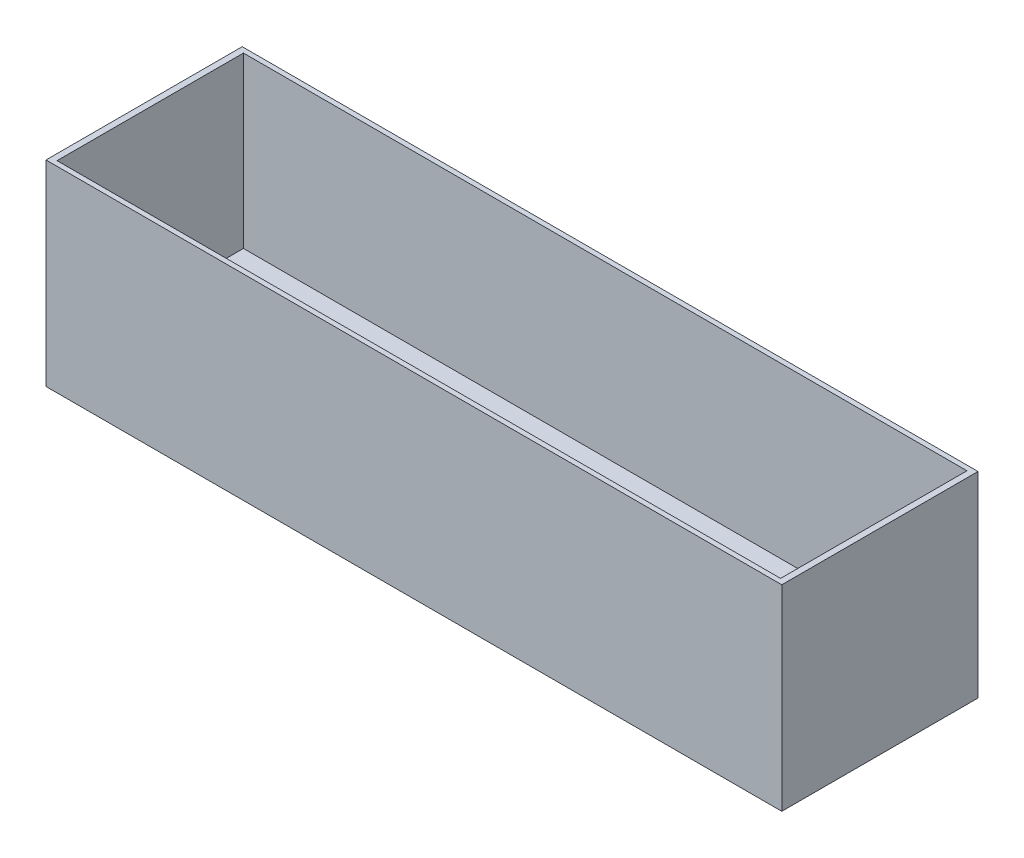
ISO-10303-21;
HEADER;
FILE_DESCRIPTION(('STEP AP214'),'2;1');
FILE_NAME('part.step','',(''),(''),'','','');
FILE_SCHEMA(('AUTOMOTIVE_DESIGN { 1 0 10303 214 1 1 1 1 }'));
ENDSEC;
DATA;
#1=APPLICATION_CONTEXT('core data for automotive mechanical design processes');
#2=APPLICATION_PROTOCOL_DEFINITION('international standard','automotive_design',2000,#1);
#3=PRODUCT_CONTEXT('',#1,'mechanical');
#4=PRODUCT('Part','Part','',(#3));
#5=PRODUCT_RELATED_PRODUCT_CATEGORY('part','',(#4));
#6=PRODUCT_DEFINITION_FORMATION('','',#4);
#7=PRODUCT_DEFINITION_CONTEXT('part definition',#1,'design');
#8=PRODUCT_DEFINITION('design','',#6,#7);
#9=PRODUCT_DEFINITION_SHAPE('','',#8);
#10=(LENGTH_UNIT() NAMED_UNIT(*) SI_UNIT(.MILLI.,.METRE.));
#11=(NAMED_UNIT(*) PLANE_ANGLE_UNIT() SI_UNIT($,.RADIAN.));
#12=(NAMED_UNIT(*) SI_UNIT($,.STERADIAN.) SOLID_ANGLE_UNIT());
#13=UNCERTAINTY_MEASURE_WITH_UNIT(LENGTH_MEASURE(1.E-05),#10,'distance_accuracy_value','');
#14=(GEOMETRIC_REPRESENTATION_CONTEXT(3) GLOBAL_UNCERTAINTY_ASSIGNED_CONTEXT((#13)) GLOBAL_UNIT_ASSIGNED_CONTEXT((#10,
#11,#12)) REPRESENTATION_CONTEXT('',''));
#15=CARTESIAN_POINT('',(0.,0.,0.));
#16=DIRECTION('',(0.,0.,1.));
#17=DIRECTION('',(1.,0.,0.));
#18=AXIS2_PLACEMENT_3D('',#15,#16,#17);
#19=CARTESIAN_POINT('',(-1500.,800.,400.));
#20=DIRECTION('',(0.,0.,-1.));
#21=DIRECTION('',(-1.,0.,0.));
#22=AXIS2_PLACEMENT_3D('',#19,#20,#21);
#23=PLANE('',#22);
#24=DIRECTION('',(1.,0.,0.));
#25=VECTOR('',#24,1.);
#26=CARTESIAN_POINT('',(-1500.,0.,400.));
#27=LINE('',#26,#25);
#28=CARTESIAN_POINT('',(-1500.,0.,400.));
#29=VERTEX_POINT('',#28);
#30=CARTESIAN_POINT('',(1500.,0.,400.));
#31=VERTEX_POINT('',#30);
#32=EDGE_CURVE('E140',#29,#31,#27,.T.);
#33=ORIENTED_EDGE('',*,*,#32,.T.);
#34=DIRECTION('',(0.,-1.,0.));
#35=VECTOR('',#34,1.);
#36=CARTESIAN_POINT('',(1500.,800.,400.));
#37=LINE('',#36,#35);
#38=CARTESIAN_POINT('',(1500.,800.,400.));
#39=VERTEX_POINT('',#38);
#40=EDGE_CURVE('E11',#39,#31,#37,.T.);
#41=ORIENTED_EDGE('',*,*,#40,.F.);
#42=DIRECTION('',(1.,0.,0.));
#43=VECTOR('',#42,1.);
#44=CARTESIAN_POINT('',(-1500.,800.,400.));
#45=LINE('',#44,#43);
#46=CARTESIAN_POINT('',(-1500.,800.,400.));
#47=VERTEX_POINT('',#46);
#48=EDGE_CURVE('E144',#47,#39,#45,.T.);
#49=ORIENTED_EDGE('',*,*,#48,.F.);
#50=DIRECTION('',(0.,-1.,0.));
#51=VECTOR('',#50,1.);
#52=CARTESIAN_POINT('',(-1500.,800.,400.));
#53=LINE('',#52,#51);
#54=EDGE_CURVE('E56',#47,#29,#53,.T.);
#55=ORIENTED_EDGE('',*,*,#54,.T.);
#56=EDGE_LOOP('',(#33,#41,#49,#55));
#57=FACE_BOUND('',#56,.T.);
#58=ADVANCED_FACE('F33',(#57),#23,.F.);
#59=CARTESIAN_POINT('',(1500.,800.,400.));
#60=DIRECTION('',(-1.,0.,0.));
#61=DIRECTION('',(0.,0.,1.));
#62=AXIS2_PLACEMENT_3D('',#59,#60,#61);
#63=PLANE('',#62);
#64=DIRECTION('',(0.,0.,-1.));
#65=VECTOR('',#64,1.);
#66=CARTESIAN_POINT('',(1500.,0.,400.));
#67=LINE('',#66,#65);
#68=CARTESIAN_POINT('',(1500.,0.,-400.));
#69=VERTEX_POINT('',#68);
#70=EDGE_CURVE('E154',#31,#69,#67,.T.);
#71=ORIENTED_EDGE('',*,*,#70,.T.);
#72=DIRECTION('',(0.,-1.,0.));
#73=VECTOR('',#72,1.);
#74=CARTESIAN_POINT('',(1500.,800.,-400.));
#75=LINE('',#74,#73);
#76=CARTESIAN_POINT('',(1500.,800.,-400.));
#77=VERTEX_POINT('',#76);
#78=EDGE_CURVE('E40',#77,#69,#75,.T.);
#79=ORIENTED_EDGE('',*,*,#78,.F.);
#80=DIRECTION('',(0.,0.,-1.));
#81=VECTOR('',#80,1.);
#82=CARTESIAN_POINT('',(1500.,800.,400.));
#83=LINE('',#82,#81);
#84=EDGE_CURVE('E82',#39,#77,#83,.T.);
#85=ORIENTED_EDGE('',*,*,#84,.F.);
#86=ORIENTED_EDGE('',*,*,#40,.T.);
#87=EDGE_LOOP('',(#71,#79,#85,#86));
#88=FACE_BOUND('',#87,.T.);
#89=ADVANCED_FACE('F168',(#88),#63,.F.);
#90=CARTESIAN_POINT('',(-1500.,800.,-400.));
#91=DIRECTION('',(0.,0.,-1.));
#92=DIRECTION('',(-1.,0.,0.));
#93=AXIS2_PLACEMENT_3D('',#90,#91,#92);
#94=PLANE('',#93);
#95=DIRECTION('',(1.,0.,0.));
#96=VECTOR('',#95,1.);
#97=CARTESIAN_POINT('',(-1500.,0.,-400.));
#98=LINE('',#97,#96);
#99=CARTESIAN_POINT('',(-1500.,0.,-400.));
#100=VERTEX_POINT('',#99);
#101=EDGE_CURVE('E157',#100,#69,#98,.T.);
#102=ORIENTED_EDGE('',*,*,#101,.F.);
#103=DIRECTION('',(0.,-1.,0.));
#104=VECTOR('',#103,1.);
#105=CARTESIAN_POINT('',(-1500.,800.,-400.));
#106=LINE('',#105,#104);
#107=CARTESIAN_POINT('',(-1500.,800.,-400.));
#108=VERTEX_POINT('',#107);
#109=EDGE_CURVE('E163',#108,#100,#106,.T.);
#110=ORIENTED_EDGE('',*,*,#109,.F.);
#111=DIRECTION('',(1.,0.,0.));
#112=VECTOR('',#111,1.);
#113=CARTESIAN_POINT('',(-1500.,800.,-400.));
#114=LINE('',#113,#112);
#115=EDGE_CURVE('E148',#108,#77,#114,.T.);
#116=ORIENTED_EDGE('',*,*,#115,.T.);
#117=ORIENTED_EDGE('',*,*,#78,.T.);
#118=EDGE_LOOP('',(#102,#110,#116,#117));
#119=FACE_BOUND('',#118,.T.);
#120=ADVANCED_FACE('F166',(#119),#94,.T.);
#121=CARTESIAN_POINT('',(-1500.,800.,400.));
#122=DIRECTION('',(-1.,0.,0.));
#123=DIRECTION('',(0.,0.,1.));
#124=AXIS2_PLACEMENT_3D('',#121,#122,#123);
#125=PLANE('',#124);
#126=DIRECTION('',(0.,0.,-1.));
#127=VECTOR('',#126,1.);
#128=CARTESIAN_POINT('',(-1500.,0.,400.));
#129=LINE('',#128,#127);
#130=EDGE_CURVE('E146',#29,#100,#129,.T.);
#131=ORIENTED_EDGE('',*,*,#130,.F.);
#132=ORIENTED_EDGE('',*,*,#54,.F.);
#133=DIRECTION('',(0.,0.,-1.));
#134=VECTOR('',#133,1.);
#135=CARTESIAN_POINT('',(-1500.,800.,400.));
#136=LINE('',#135,#134);
#137=EDGE_CURVE('E151',#47,#108,#136,.T.);
#138=ORIENTED_EDGE('',*,*,#137,.T.);
#139=ORIENTED_EDGE('',*,*,#109,.T.);
#140=EDGE_LOOP('',(#131,#132,#138,#139));
#141=FACE_BOUND('',#140,.T.);
#142=ADVANCED_FACE('F172',(#141),#125,.T.);
#143=CARTESIAN_POINT('',(0.,800.,0.));
#144=DIRECTION('',(0.,1.,0.));
#145=DIRECTION('',(0.,0.,1.));
#146=AXIS2_PLACEMENT_3D('',#143,#144,#145);
#147=PLANE('',#146);
#148=DIRECTION('',(0.,0.,1.));
#149=VECTOR('',#148,1.);
#150=CARTESIAN_POINT('',(-1475.,800.,-380.));
#151=LINE('',#150,#149);
#152=CARTESIAN_POINT('',(-1475.,800.,-380.));
#153=VERTEX_POINT('',#152);
#154=CARTESIAN_POINT('',(-1475.,800.,380.));
#155=VERTEX_POINT('',#154);
#156=EDGE_CURVE('E47',#153,#155,#151,.T.);
#157=ORIENTED_EDGE('',*,*,#156,.F.);
#158=DIRECTION('',(-1.,0.,0.));
#159=VECTOR('',#158,1.);
#160=CARTESIAN_POINT('',(1475.,800.,-380.));
#161=LINE('',#160,#159);
#162=CARTESIAN_POINT('',(1475.,800.,-380.));
#163=VERTEX_POINT('',#162);
#164=EDGE_CURVE('E125',#163,#153,#161,.T.);
#165=ORIENTED_EDGE('',*,*,#164,.F.);
#166=DIRECTION('',(0.,0.,-1.));
#167=VECTOR('',#166,1.);
#168=CARTESIAN_POINT('',(1475.,800.,-380.));
#169=LINE('',#168,#167);
#170=CARTESIAN_POINT('',(1475.,800.,380.));
#171=VERTEX_POINT('',#170);
#172=EDGE_CURVE('E128',#171,#163,#169,.T.);
#173=ORIENTED_EDGE('',*,*,#172,.F.);
#174=DIRECTION('',(1.,0.,0.));
#175=VECTOR('',#174,1.);
#176=CARTESIAN_POINT('',(1475.,800.,380.));
#177=LINE('',#176,#175);
#178=EDGE_CURVE('E134',#155,#171,#177,.T.);
#179=ORIENTED_EDGE('',*,*,#178,.F.);
#180=EDGE_LOOP('',(#157,#165,#173,#179));
#181=FACE_BOUND('',#180,.T.);
#182=ORIENTED_EDGE('',*,*,#48,.T.);
#183=ORIENTED_EDGE('',*,*,#84,.T.);
#184=ORIENTED_EDGE('',*,*,#115,.F.);
#185=ORIENTED_EDGE('',*,*,#137,.F.);
#186=EDGE_LOOP('',(#182,#183,#184,#185));
#187=FACE_BOUND('',#186,.T.);
#188=ADVANCED_FACE('F175',(#181,#187),#147,.T.);
#189=CARTESIAN_POINT('',(0.,0.,0.));
#190=DIRECTION('',(0.,1.,0.));
#191=DIRECTION('',(0.,0.,1.));
#192=AXIS2_PLACEMENT_3D('',#189,#190,#191);
#193=PLANE('',#192);
#194=ORIENTED_EDGE('',*,*,#32,.F.);
#195=ORIENTED_EDGE('',*,*,#130,.T.);
#196=ORIENTED_EDGE('',*,*,#101,.T.);
#197=ORIENTED_EDGE('',*,*,#70,.F.);
#198=EDGE_LOOP('',(#194,#195,#196,#197));
#199=FACE_BOUND('',#198,.T.);
#200=ADVANCED_FACE('F171',(#199),#193,.F.);
#201=CARTESIAN_POINT('',(-1475.,110.,-380.));
#202=DIRECTION('',(-1.,0.,0.));
#203=DIRECTION('',(0.,0.,1.));
#204=AXIS2_PLACEMENT_3D('',#201,#202,#203);
#205=PLANE('',#204);
#206=ORIENTED_EDGE('',*,*,#156,.T.);
#207=DIRECTION('',(0.,1.,0.));
#208=VECTOR('',#207,1.);
#209=CARTESIAN_POINT('',(-1475.,110.,380.));
#210=LINE('',#209,#208);
#211=CARTESIAN_POINT('',(-1475.,110.,380.));
#212=VERTEX_POINT('',#211);
#213=EDGE_CURVE('E103',#212,#155,#210,.T.);
#214=ORIENTED_EDGE('',*,*,#213,.F.);
#215=DIRECTION('',(0.,0.,1.));
#216=VECTOR('',#215,1.);
#217=CARTESIAN_POINT('',(-1475.,110.,-380.));
#218=LINE('',#217,#216);
#219=CARTESIAN_POINT('',(-1475.,110.,-380.));
#220=VERTEX_POINT('',#219);
#221=EDGE_CURVE('E107',#220,#212,#218,.T.);
#222=ORIENTED_EDGE('',*,*,#221,.F.);
#223=DIRECTION('',(0.,1.,0.));
#224=VECTOR('',#223,1.);
#225=CARTESIAN_POINT('',(-1475.,110.,-380.));
#226=LINE('',#225,#224);
#227=EDGE_CURVE('E138',#220,#153,#226,.T.);
#228=ORIENTED_EDGE('',*,*,#227,.T.);
#229=EDGE_LOOP('',(#206,#214,#222,#228));
#230=FACE_BOUND('',#229,.T.);
#231=ADVANCED_FACE('F105',(#230),#205,.F.);
#232=CARTESIAN_POINT('',(1475.,110.,-380.));
#233=DIRECTION('',(0.,0.,-1.));
#234=DIRECTION('',(-1.,0.,0.));
#235=AXIS2_PLACEMENT_3D('',#232,#233,#234);
#236=PLANE('',#235);
#237=ORIENTED_EDGE('',*,*,#164,.T.);
#238=ORIENTED_EDGE('',*,*,#227,.F.);
#239=DIRECTION('',(-1.,0.,0.));
#240=VECTOR('',#239,1.);
#241=CARTESIAN_POINT('',(1475.,110.,-380.));
#242=LINE('',#241,#240);
#243=CARTESIAN_POINT('',(1475.,110.,-380.));
#244=VERTEX_POINT('',#243);
#245=EDGE_CURVE('E113',#244,#220,#242,.T.);
#246=ORIENTED_EDGE('',*,*,#245,.F.);
#247=DIRECTION('',(0.,1.,0.));
#248=VECTOR('',#247,1.);
#249=CARTESIAN_POINT('',(1475.,110.,-380.));
#250=LINE('',#249,#248);
#251=EDGE_CURVE('E141',#244,#163,#250,.T.);
#252=ORIENTED_EDGE('',*,*,#251,.T.);
#253=EDGE_LOOP('',(#237,#238,#246,#252));
#254=FACE_BOUND('',#253,.T.);
#255=ADVANCED_FACE('F194',(#254),#236,.F.);
#256=CARTESIAN_POINT('',(1475.,110.,-380.));
#257=DIRECTION('',(1.,0.,0.));
#258=DIRECTION('',(0.,0.,-1.));
#259=AXIS2_PLACEMENT_3D('',#256,#257,#258);
#260=PLANE('',#259);
#261=ORIENTED_EDGE('',*,*,#172,.T.);
#262=ORIENTED_EDGE('',*,*,#251,.F.);
#263=DIRECTION('',(0.,0.,-1.));
#264=VECTOR('',#263,1.);
#265=CARTESIAN_POINT('',(1475.,110.,-380.));
#266=LINE('',#265,#264);
#267=CARTESIAN_POINT('',(1475.,110.,380.));
#268=VERTEX_POINT('',#267);
#269=EDGE_CURVE('E121',#268,#244,#266,.T.);
#270=ORIENTED_EDGE('',*,*,#269,.F.);
#271=DIRECTION('',(0.,1.,0.));
#272=VECTOR('',#271,1.);
#273=CARTESIAN_POINT('',(1475.,110.,380.));
#274=LINE('',#273,#272);
#275=EDGE_CURVE('E112',#268,#171,#274,.T.);
#276=ORIENTED_EDGE('',*,*,#275,.T.);
#277=EDGE_LOOP('',(#261,#262,#270,#276));
#278=FACE_BOUND('',#277,.T.);
#279=ADVANCED_FACE('F197',(#278),#260,.F.);
#280=CARTESIAN_POINT('',(1475.,110.,380.));
#281=DIRECTION('',(0.,0.,1.));
#282=DIRECTION('',(1.,0.,0.));
#283=AXIS2_PLACEMENT_3D('',#280,#281,#282);
#284=PLANE('',#283);
#285=ORIENTED_EDGE('',*,*,#178,.T.);
#286=ORIENTED_EDGE('',*,*,#275,.F.);
#287=DIRECTION('',(1.,0.,0.));
#288=VECTOR('',#287,1.);
#289=CARTESIAN_POINT('',(1475.,110.,380.));
#290=LINE('',#289,#288);
#291=EDGE_CURVE('E116',#212,#268,#290,.T.);
#292=ORIENTED_EDGE('',*,*,#291,.F.);
#293=ORIENTED_EDGE('',*,*,#213,.T.);
#294=EDGE_LOOP('',(#285,#286,#292,#293));
#295=FACE_BOUND('',#294,.T.);
#296=ADVANCED_FACE('F117',(#295),#284,.F.);
#297=CARTESIAN_POINT('',(0.,110.,0.));
#298=DIRECTION('',(0.,-1.,0.));
#299=DIRECTION('',(0.,0.,-1.));
#300=AXIS2_PLACEMENT_3D('',#297,#298,#299);
#301=PLANE('',#300);
#302=ORIENTED_EDGE('',*,*,#221,.T.);
#303=ORIENTED_EDGE('',*,*,#291,.T.);
#304=ORIENTED_EDGE('',*,*,#269,.T.);
#305=ORIENTED_EDGE('',*,*,#245,.T.);
#306=EDGE_LOOP('',(#302,#303,#304,#305));
#307=FACE_BOUND('',#306,.T.);
#308=ADVANCED_FACE('F123',(#307),#301,.F.);
#309=CLOSED_SHELL('',(#58,#89,#120,#142,#188,#200,#231,#255,#279,#296,#308));
#310=MANIFOLD_SOLID_BREP('B2',#309);
#311=ADVANCED_BREP_SHAPE_REPRESENTATION('',(#18,#310),#14);
#312=SHAPE_DEFINITION_REPRESENTATION(#9,#311);
ENDSEC;
END-ISO-10303-21;
